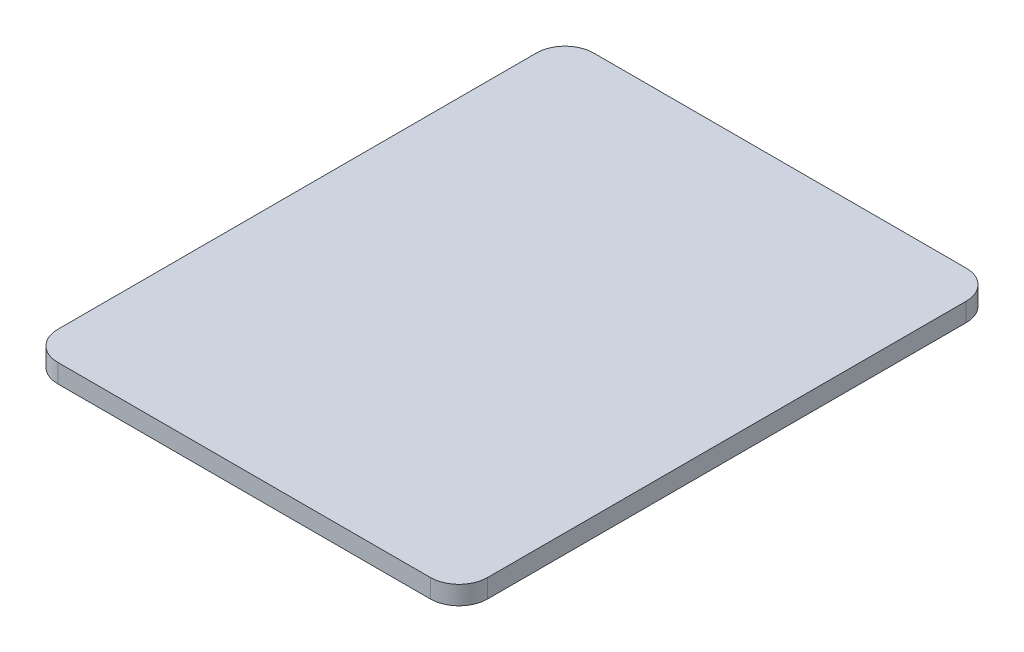
ISO-10303-21;
HEADER;
FILE_DESCRIPTION(('STEP AP214'),'2;1');
FILE_NAME('part.step','',(''),(''),'','','');
FILE_SCHEMA(('AUTOMOTIVE_DESIGN { 1 0 10303 214 1 1 1 1 }'));
ENDSEC;
DATA;
#1=APPLICATION_CONTEXT('core data for automotive mechanical design processes');
#2=APPLICATION_PROTOCOL_DEFINITION('international standard','automotive_design',2000,#1);
#3=PRODUCT_CONTEXT('',#1,'mechanical');
#4=PRODUCT('Part','Part','',(#3));
#5=PRODUCT_RELATED_PRODUCT_CATEGORY('part','',(#4));
#6=PRODUCT_DEFINITION_FORMATION('','',#4);
#7=PRODUCT_DEFINITION_CONTEXT('part definition',#1,'design');
#8=PRODUCT_DEFINITION('design','',#6,#7);
#9=PRODUCT_DEFINITION_SHAPE('','',#8);
#10=(LENGTH_UNIT() NAMED_UNIT(*) SI_UNIT(.MILLI.,.METRE.));
#11=(NAMED_UNIT(*) PLANE_ANGLE_UNIT() SI_UNIT($,.RADIAN.));
#12=(NAMED_UNIT(*) SI_UNIT($,.STERADIAN.) SOLID_ANGLE_UNIT());
#13=UNCERTAINTY_MEASURE_WITH_UNIT(LENGTH_MEASURE(1.E-05),#10,'distance_accuracy_value','');
#14=(GEOMETRIC_REPRESENTATION_CONTEXT(3) GLOBAL_UNCERTAINTY_ASSIGNED_CONTEXT((#13)) GLOBAL_UNIT_ASSIGNED_CONTEXT((#10,
#11,#12)) REPRESENTATION_CONTEXT('',''));
#15=CARTESIAN_POINT('',(0.,0.,0.));
#16=DIRECTION('',(0.,0.,1.));
#17=DIRECTION('',(1.,0.,0.));
#18=AXIS2_PLACEMENT_3D('',#15,#16,#17);
#19=CARTESIAN_POINT('',(15.,1.3,-18.7));
#20=DIRECTION('',(-1.,0.,0.));
#21=DIRECTION('',(0.,0.,1.));
#22=AXIS2_PLACEMENT_3D('',#19,#20,#21);
#23=PLANE('',#22);
#24=DIRECTION('',(0.,0.,-1.));
#25=VECTOR('',#24,1.);
#26=CARTESIAN_POINT('',(15.,0.,-18.7));
#27=LINE('',#26,#25);
#28=CARTESIAN_POINT('',(15.,0.,16.7));
#29=VERTEX_POINT('',#28);
#30=CARTESIAN_POINT('',(15.,0.,-16.7));
#31=VERTEX_POINT('',#30);
#32=EDGE_CURVE('E130',#29,#31,#27,.T.);
#33=ORIENTED_EDGE('',*,*,#32,.T.);
#34=DIRECTION('',(0.,-1.,0.));
#35=VECTOR('',#34,1.);
#36=CARTESIAN_POINT('',(15.,1.3,-16.7));
#37=LINE('',#36,#35);
#38=CARTESIAN_POINT('',(15.,1.3,-16.7));
#39=VERTEX_POINT('',#38);
#40=EDGE_CURVE('E153',#31,#39,#37,.F.);
#41=ORIENTED_EDGE('',*,*,#40,.T.);
#42=DIRECTION('',(0.,0.,-1.));
#43=VECTOR('',#42,1.);
#44=CARTESIAN_POINT('',(15.,1.3,-18.7));
#45=LINE('',#44,#43);
#46=CARTESIAN_POINT('',(15.,1.3,16.7));
#47=VERTEX_POINT('',#46);
#48=EDGE_CURVE('E128',#47,#39,#45,.T.);
#49=ORIENTED_EDGE('',*,*,#48,.F.);
#50=DIRECTION('',(0.,-1.,0.));
#51=VECTOR('',#50,1.);
#52=CARTESIAN_POINT('',(15.,1.3,16.7));
#53=LINE('',#52,#51);
#54=EDGE_CURVE('E150',#47,#29,#53,.T.);
#55=ORIENTED_EDGE('',*,*,#54,.T.);
#56=EDGE_LOOP('',(#33,#41,#49,#55));
#57=FACE_BOUND('',#56,.T.);
#58=ADVANCED_FACE('F35',(#57),#23,.F.);
#59=CARTESIAN_POINT('',(-15.,1.3,-18.7));
#60=DIRECTION('',(0.,0.,1.));
#61=DIRECTION('',(1.,0.,0.));
#62=AXIS2_PLACEMENT_3D('',#59,#60,#61);
#63=PLANE('',#62);
#64=DIRECTION('',(-1.,0.,0.));
#65=VECTOR('',#64,1.);
#66=CARTESIAN_POINT('',(-15.,0.,-18.7));
#67=LINE('',#66,#65);
#68=CARTESIAN_POINT('',(13.,0.,-18.7));
#69=VERTEX_POINT('',#68);
#70=CARTESIAN_POINT('',(-13.,0.,-18.7));
#71=VERTEX_POINT('',#70);
#72=EDGE_CURVE('E126',#69,#71,#67,.T.);
#73=ORIENTED_EDGE('',*,*,#72,.T.);
#74=DIRECTION('',(0.,-1.,0.));
#75=VECTOR('',#74,1.);
#76=CARTESIAN_POINT('',(-13.,1.3,-18.7));
#77=LINE('',#76,#75);
#78=CARTESIAN_POINT('',(-13.,1.3,-18.7));
#79=VERTEX_POINT('',#78);
#80=EDGE_CURVE('E105',#71,#79,#77,.F.);
#81=ORIENTED_EDGE('',*,*,#80,.T.);
#82=DIRECTION('',(-1.,0.,0.));
#83=VECTOR('',#82,1.);
#84=CARTESIAN_POINT('',(-15.,1.3,-18.7));
#85=LINE('',#84,#83);
#86=CARTESIAN_POINT('',(13.,1.3,-18.7));
#87=VERTEX_POINT('',#86);
#88=EDGE_CURVE('E169',#87,#79,#85,.T.);
#89=ORIENTED_EDGE('',*,*,#88,.F.);
#90=DIRECTION('',(0.,-1.,0.));
#91=VECTOR('',#90,1.);
#92=CARTESIAN_POINT('',(13.,1.3,-18.7));
#93=LINE('',#92,#91);
#94=EDGE_CURVE('E110',#87,#69,#93,.T.);
#95=ORIENTED_EDGE('',*,*,#94,.T.);
#96=EDGE_LOOP('',(#73,#81,#89,#95));
#97=FACE_BOUND('',#96,.T.);
#98=ADVANCED_FACE('F186',(#97),#63,.F.);
#99=CARTESIAN_POINT('',(-15.,1.3,-18.7));
#100=DIRECTION('',(1.,0.,0.));
#101=DIRECTION('',(0.,0.,-1.));
#102=AXIS2_PLACEMENT_3D('',#99,#100,#101);
#103=PLANE('',#102);
#104=DIRECTION('',(0.,0.,1.));
#105=VECTOR('',#104,1.);
#106=CARTESIAN_POINT('',(-15.,1.3,-18.7));
#107=LINE('',#106,#105);
#108=CARTESIAN_POINT('',(-15.,1.3,-16.7));
#109=VERTEX_POINT('',#108);
#110=CARTESIAN_POINT('',(-15.,1.3,16.7));
#111=VERTEX_POINT('',#110);
#112=EDGE_CURVE('E119',#109,#111,#107,.T.);
#113=ORIENTED_EDGE('',*,*,#112,.F.);
#114=DIRECTION('',(0.,-1.,0.));
#115=VECTOR('',#114,1.);
#116=CARTESIAN_POINT('',(-15.,1.3,-16.7));
#117=LINE('',#116,#115);
#118=CARTESIAN_POINT('',(-15.,0.,-16.7));
#119=VERTEX_POINT('',#118);
#120=EDGE_CURVE('E104',#109,#119,#117,.T.);
#121=ORIENTED_EDGE('',*,*,#120,.T.);
#122=DIRECTION('',(0.,0.,1.));
#123=VECTOR('',#122,1.);
#124=CARTESIAN_POINT('',(-15.,0.,-18.7));
#125=LINE('',#124,#123);
#126=CARTESIAN_POINT('',(-15.,0.,16.7));
#127=VERTEX_POINT('',#126);
#128=EDGE_CURVE('E117',#119,#127,#125,.T.);
#129=ORIENTED_EDGE('',*,*,#128,.T.);
#130=DIRECTION('',(0.,-1.,0.));
#131=VECTOR('',#130,1.);
#132=CARTESIAN_POINT('',(-15.,1.3,16.7));
#133=LINE('',#132,#131);
#134=EDGE_CURVE('E121',#127,#111,#133,.F.);
#135=ORIENTED_EDGE('',*,*,#134,.T.);
#136=EDGE_LOOP('',(#113,#121,#129,#135));
#137=FACE_BOUND('',#136,.T.);
#138=ADVANCED_FACE('F116',(#137),#103,.F.);
#139=CARTESIAN_POINT('',(-15.,1.3,18.7));
#140=DIRECTION('',(0.,0.,-1.));
#141=DIRECTION('',(-1.,0.,0.));
#142=AXIS2_PLACEMENT_3D('',#139,#140,#141);
#143=PLANE('',#142);
#144=DIRECTION('',(1.,0.,0.));
#145=VECTOR('',#144,1.);
#146=CARTESIAN_POINT('',(-15.,0.,18.7));
#147=LINE('',#146,#145);
#148=CARTESIAN_POINT('',(-13.,0.,18.7));
#149=VERTEX_POINT('',#148);
#150=CARTESIAN_POINT('',(13.,0.,18.7));
#151=VERTEX_POINT('',#150);
#152=EDGE_CURVE('E125',#149,#151,#147,.T.);
#153=ORIENTED_EDGE('',*,*,#152,.T.);
#154=DIRECTION('',(0.,-1.,0.));
#155=VECTOR('',#154,1.);
#156=CARTESIAN_POINT('',(13.,1.3,18.7));
#157=LINE('',#156,#155);
#158=CARTESIAN_POINT('',(13.,1.3,18.7));
#159=VERTEX_POINT('',#158);
#160=EDGE_CURVE('E11',#151,#159,#157,.F.);
#161=ORIENTED_EDGE('',*,*,#160,.T.);
#162=DIRECTION('',(1.,0.,0.));
#163=VECTOR('',#162,1.);
#164=CARTESIAN_POINT('',(-15.,1.3,18.7));
#165=LINE('',#164,#163);
#166=CARTESIAN_POINT('',(-13.,1.3,18.7));
#167=VERTEX_POINT('',#166);
#168=EDGE_CURVE('E134',#167,#159,#165,.T.);
#169=ORIENTED_EDGE('',*,*,#168,.F.);
#170=DIRECTION('',(0.,-1.,0.));
#171=VECTOR('',#170,1.);
#172=CARTESIAN_POINT('',(-13.,1.3,18.7));
#173=LINE('',#172,#171);
#174=EDGE_CURVE('E43',#167,#149,#173,.T.);
#175=ORIENTED_EDGE('',*,*,#174,.T.);
#176=EDGE_LOOP('',(#153,#161,#169,#175));
#177=FACE_BOUND('',#176,.T.);
#178=ADVANCED_FACE('F156',(#177),#143,.F.);
#179=CARTESIAN_POINT('',(0.,1.3,0.));
#180=DIRECTION('',(0.,1.,0.));
#181=DIRECTION('',(0.,0.,1.));
#182=AXIS2_PLACEMENT_3D('',#179,#180,#181);
#183=PLANE('',#182);
#184=ORIENTED_EDGE('',*,*,#88,.T.);
#185=CARTESIAN_POINT('',(-13.,1.3,-16.7));
#186=DIRECTION('',(0.,1.,0.));
#187=DIRECTION('',(0.,0.,1.));
#188=AXIS2_PLACEMENT_3D('',#185,#186,#187);
#189=CIRCLE('',#188,2.);
#190=EDGE_CURVE('E148',#79,#109,#189,.T.);
#191=ORIENTED_EDGE('',*,*,#190,.T.);
#192=ORIENTED_EDGE('',*,*,#112,.T.);
#193=CARTESIAN_POINT('',(-13.,1.3,16.7));
#194=DIRECTION('',(0.,1.,0.));
#195=DIRECTION('',(0.,0.,1.));
#196=AXIS2_PLACEMENT_3D('',#193,#194,#195);
#197=CIRCLE('',#196,2.);
#198=EDGE_CURVE('E55',#111,#167,#197,.T.);
#199=ORIENTED_EDGE('',*,*,#198,.T.);
#200=ORIENTED_EDGE('',*,*,#168,.T.);
#201=CARTESIAN_POINT('',(13.,1.3,16.7));
#202=DIRECTION('',(0.,1.,0.));
#203=DIRECTION('',(0.,0.,1.));
#204=AXIS2_PLACEMENT_3D('',#201,#202,#203);
#205=CIRCLE('',#204,2.);
#206=EDGE_CURVE('E144',#159,#47,#205,.T.);
#207=ORIENTED_EDGE('',*,*,#206,.T.);
#208=ORIENTED_EDGE('',*,*,#48,.T.);
#209=CARTESIAN_POINT('',(13.,1.3,-16.7));
#210=DIRECTION('',(0.,1.,0.));
#211=DIRECTION('',(0.,0.,1.));
#212=AXIS2_PLACEMENT_3D('',#209,#210,#211);
#213=CIRCLE('',#212,2.);
#214=EDGE_CURVE('E146',#39,#87,#213,.T.);
#215=ORIENTED_EDGE('',*,*,#214,.T.);
#216=EDGE_LOOP('',(#184,#191,#192,#199,#200,#207,#208,#215));
#217=FACE_BOUND('',#216,.T.);
#218=ADVANCED_FACE('F175',(#217),#183,.T.);
#219=CARTESIAN_POINT('',(0.,0.,0.));
#220=DIRECTION('',(0.,1.,0.));
#221=DIRECTION('',(0.,0.,1.));
#222=AXIS2_PLACEMENT_3D('',#219,#220,#221);
#223=PLANE('',#222);
#224=ORIENTED_EDGE('',*,*,#128,.F.);
#225=CARTESIAN_POINT('',(-13.,0.,-16.7));
#226=DIRECTION('',(0.,1.,0.));
#227=DIRECTION('',(0.,0.,1.));
#228=AXIS2_PLACEMENT_3D('',#225,#226,#227);
#229=CIRCLE('',#228,2.);
#230=EDGE_CURVE('E100',#119,#71,#229,.F.);
#231=ORIENTED_EDGE('',*,*,#230,.T.);
#232=ORIENTED_EDGE('',*,*,#72,.F.);
#233=CARTESIAN_POINT('',(13.,0.,-16.7));
#234=DIRECTION('',(0.,1.,0.));
#235=DIRECTION('',(0.,0.,1.));
#236=AXIS2_PLACEMENT_3D('',#233,#234,#235);
#237=CIRCLE('',#236,2.);
#238=EDGE_CURVE('E111',#69,#31,#237,.F.);
#239=ORIENTED_EDGE('',*,*,#238,.T.);
#240=ORIENTED_EDGE('',*,*,#32,.F.);
#241=CARTESIAN_POINT('',(13.,0.,16.7));
#242=DIRECTION('',(0.,1.,0.));
#243=DIRECTION('',(0.,0.,1.));
#244=AXIS2_PLACEMENT_3D('',#241,#242,#243);
#245=CIRCLE('',#244,2.);
#246=EDGE_CURVE('E137',#29,#151,#245,.F.);
#247=ORIENTED_EDGE('',*,*,#246,.T.);
#248=ORIENTED_EDGE('',*,*,#152,.F.);
#249=CARTESIAN_POINT('',(-13.,0.,16.7));
#250=DIRECTION('',(0.,1.,0.));
#251=DIRECTION('',(0.,0.,1.));
#252=AXIS2_PLACEMENT_3D('',#249,#250,#251);
#253=CIRCLE('',#252,2.);
#254=EDGE_CURVE('E120',#149,#127,#253,.F.);
#255=ORIENTED_EDGE('',*,*,#254,.T.);
#256=EDGE_LOOP('',(#224,#231,#232,#239,#240,#247,#248,#255));
#257=FACE_BOUND('',#256,.T.);
#258=ADVANCED_FACE('F123',(#257),#223,.F.);
#259=CARTESIAN_POINT('',(-13.,1.3,-16.7));
#260=DIRECTION('',(0.,-1.,0.));
#261=DIRECTION('',(0.,0.,-1.));
#262=AXIS2_PLACEMENT_3D('',#259,#260,#261);
#263=CYLINDRICAL_SURFACE('',#262,2.);
#264=ORIENTED_EDGE('',*,*,#190,.F.);
#265=ORIENTED_EDGE('',*,*,#80,.F.);
#266=ORIENTED_EDGE('',*,*,#230,.F.);
#267=ORIENTED_EDGE('',*,*,#120,.F.);
#268=EDGE_LOOP('',(#264,#265,#266,#267));
#269=FACE_BOUND('',#268,.T.);
#270=ADVANCED_FACE('F103',(#269),#263,.T.);
#271=CARTESIAN_POINT('',(13.,1.3,-16.7));
#272=DIRECTION('',(0.,-1.,0.));
#273=DIRECTION('',(0.,0.,-1.));
#274=AXIS2_PLACEMENT_3D('',#271,#272,#273);
#275=CYLINDRICAL_SURFACE('',#274,2.);
#276=ORIENTED_EDGE('',*,*,#214,.F.);
#277=ORIENTED_EDGE('',*,*,#40,.F.);
#278=ORIENTED_EDGE('',*,*,#238,.F.);
#279=ORIENTED_EDGE('',*,*,#94,.F.);
#280=EDGE_LOOP('',(#276,#277,#278,#279));
#281=FACE_BOUND('',#280,.T.);
#282=ADVANCED_FACE('F197',(#281),#275,.T.);
#283=CARTESIAN_POINT('',(13.,1.3,16.7));
#284=DIRECTION('',(0.,-1.,0.));
#285=DIRECTION('',(0.,0.,-1.));
#286=AXIS2_PLACEMENT_3D('',#283,#284,#285);
#287=CYLINDRICAL_SURFACE('',#286,2.);
#288=ORIENTED_EDGE('',*,*,#206,.F.);
#289=ORIENTED_EDGE('',*,*,#160,.F.);
#290=ORIENTED_EDGE('',*,*,#246,.F.);
#291=ORIENTED_EDGE('',*,*,#54,.F.);
#292=EDGE_LOOP('',(#288,#289,#290,#291));
#293=FACE_BOUND('',#292,.T.);
#294=ADVANCED_FACE('F163',(#293),#287,.T.);
#295=CARTESIAN_POINT('',(-13.,1.3,16.7));
#296=DIRECTION('',(0.,-1.,0.));
#297=DIRECTION('',(0.,0.,-1.));
#298=AXIS2_PLACEMENT_3D('',#295,#296,#297);
#299=CYLINDRICAL_SURFACE('',#298,2.);
#300=ORIENTED_EDGE('',*,*,#198,.F.);
#301=ORIENTED_EDGE('',*,*,#134,.F.);
#302=ORIENTED_EDGE('',*,*,#254,.F.);
#303=ORIENTED_EDGE('',*,*,#174,.F.);
#304=EDGE_LOOP('',(#300,#301,#302,#303));
#305=FACE_BOUND('',#304,.T.);
#306=ADVANCED_FACE('F37',(#305),#299,.T.);
#307=CLOSED_SHELL('',(#58,#98,#138,#178,#218,#258,#270,#282,#294,#306));
#308=MANIFOLD_SOLID_BREP('B2',#307);
#309=ADVANCED_BREP_SHAPE_REPRESENTATION('',(#18,#308),#14);
#310=SHAPE_DEFINITION_REPRESENTATION(#9,#309);
ENDSEC;
END-ISO-10303-21;
